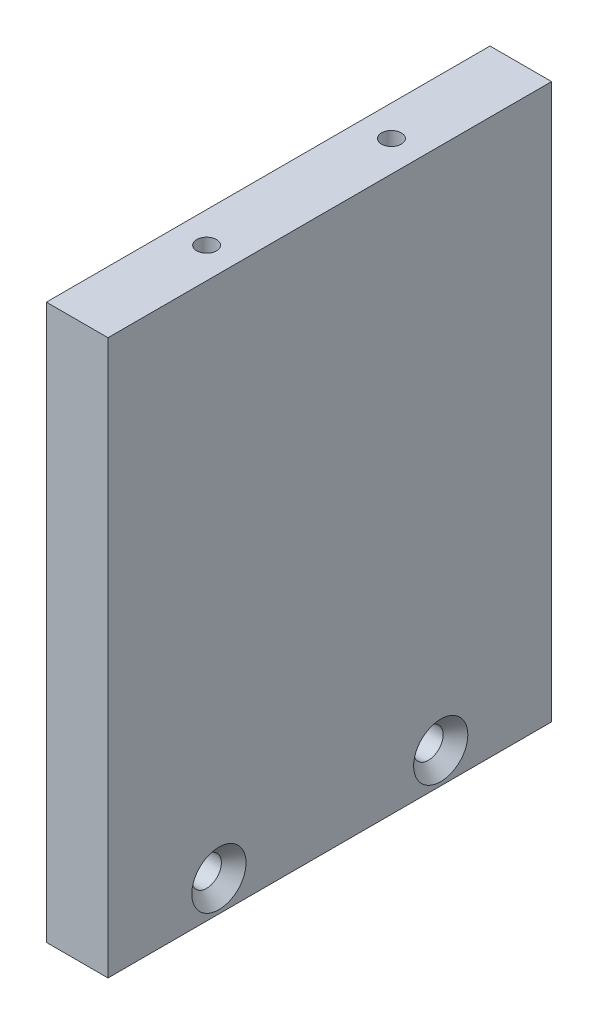
ISO-10303-21;
HEADER;
FILE_DESCRIPTION(('STEP AP214'),'2;1');
FILE_NAME('part.step','',(''),(''),'','','');
FILE_SCHEMA(('AUTOMOTIVE_DESIGN { 1 0 10303 214 1 1 1 1 }'));
ENDSEC;
DATA;
#1=APPLICATION_CONTEXT('core data for automotive mechanical design processes');
#2=APPLICATION_PROTOCOL_DEFINITION('international standard','automotive_design',2000,#1);
#3=PRODUCT_CONTEXT('',#1,'mechanical');
#4=PRODUCT('Part','Part','',(#3));
#5=PRODUCT_RELATED_PRODUCT_CATEGORY('part','',(#4));
#6=PRODUCT_DEFINITION_FORMATION('','',#4);
#7=PRODUCT_DEFINITION_CONTEXT('part definition',#1,'design');
#8=PRODUCT_DEFINITION('design','',#6,#7);
#9=PRODUCT_DEFINITION_SHAPE('','',#8);
#10=(LENGTH_UNIT() NAMED_UNIT(*) SI_UNIT(.MILLI.,.METRE.));
#11=(NAMED_UNIT(*) PLANE_ANGLE_UNIT() SI_UNIT($,.RADIAN.));
#12=(NAMED_UNIT(*) SI_UNIT($,.STERADIAN.) SOLID_ANGLE_UNIT());
#13=UNCERTAINTY_MEASURE_WITH_UNIT(LENGTH_MEASURE(1.E-05),#10,'distance_accuracy_value','');
#14=(GEOMETRIC_REPRESENTATION_CONTEXT(3) GLOBAL_UNCERTAINTY_ASSIGNED_CONTEXT((#13)) GLOBAL_UNIT_ASSIGNED_CONTEXT((#10,
#11,#12)) REPRESENTATION_CONTEXT('',''));
#15=CARTESIAN_POINT('',(0.,0.,0.));
#16=DIRECTION('',(0.,0.,1.));
#17=DIRECTION('',(1.,0.,0.));
#18=AXIS2_PLACEMENT_3D('',#15,#16,#17);
#19=CARTESIAN_POINT('',(5.,-22.5,18.));
#20=DIRECTION('',(0.,0.,-1.));
#21=DIRECTION('',(-1.,0.,0.));
#22=AXIS2_PLACEMENT_3D('',#19,#20,#21);
#23=PLANE('',#22);
#24=DIRECTION('',(0.,-1.,0.));
#25=VECTOR('',#24,1.);
#26=CARTESIAN_POINT('',(0.,-22.5,18.));
#27=LINE('',#26,#25);
#28=CARTESIAN_POINT('',(0.,22.5,18.));
#29=VERTEX_POINT('',#28);
#30=CARTESIAN_POINT('',(0.,-22.5,18.));
#31=VERTEX_POINT('',#30);
#32=EDGE_CURVE('E131',#29,#31,#27,.T.);
#33=ORIENTED_EDGE('',*,*,#32,.T.);
#34=DIRECTION('',(-1.,0.,0.));
#35=VECTOR('',#34,1.);
#36=CARTESIAN_POINT('',(5.,-22.5,18.));
#37=LINE('',#36,#35);
#38=CARTESIAN_POINT('',(5.,-22.5,18.));
#39=VERTEX_POINT('',#38);
#40=EDGE_CURVE('E13',#39,#31,#37,.T.);
#41=ORIENTED_EDGE('',*,*,#40,.F.);
#42=DIRECTION('',(0.,-1.,0.));
#43=VECTOR('',#42,1.);
#44=CARTESIAN_POINT('',(5.,-22.5,18.));
#45=LINE('',#44,#43);
#46=CARTESIAN_POINT('',(5.,22.5,18.));
#47=VERTEX_POINT('',#46);
#48=EDGE_CURVE('E132',#47,#39,#45,.T.);
#49=ORIENTED_EDGE('',*,*,#48,.F.);
#50=DIRECTION('',(-1.,0.,0.));
#51=VECTOR('',#50,1.);
#52=CARTESIAN_POINT('',(5.,22.5,18.));
#53=LINE('',#52,#51);
#54=EDGE_CURVE('E138',#47,#29,#53,.T.);
#55=ORIENTED_EDGE('',*,*,#54,.T.);
#56=EDGE_LOOP('',(#33,#41,#49,#55));
#57=FACE_BOUND('',#56,.T.);
#58=ADVANCED_FACE('F54',(#57),#23,.F.);
#59=CARTESIAN_POINT('',(5.,-22.5,-18.));
#60=DIRECTION('',(0.,1.,0.));
#61=DIRECTION('',(0.,0.,1.));
#62=AXIS2_PLACEMENT_3D('',#59,#60,#61);
#63=PLANE('',#62);
#64=DIRECTION('',(0.,0.,-1.));
#65=VECTOR('',#64,1.);
#66=CARTESIAN_POINT('',(0.,-22.5,-18.));
#67=LINE('',#66,#65);
#68=CARTESIAN_POINT('',(0.,-22.5,-18.));
#69=VERTEX_POINT('',#68);
#70=EDGE_CURVE('E141',#31,#69,#67,.T.);
#71=ORIENTED_EDGE('',*,*,#70,.T.);
#72=DIRECTION('',(-1.,0.,0.));
#73=VECTOR('',#72,1.);
#74=CARTESIAN_POINT('',(5.,-22.5,-18.));
#75=LINE('',#74,#73);
#76=CARTESIAN_POINT('',(5.,-22.5,-18.));
#77=VERTEX_POINT('',#76);
#78=EDGE_CURVE('E62',#77,#69,#75,.T.);
#79=ORIENTED_EDGE('',*,*,#78,.F.);
#80=DIRECTION('',(0.,0.,-1.));
#81=VECTOR('',#80,1.);
#82=CARTESIAN_POINT('',(5.,-22.5,-18.));
#83=LINE('',#82,#81);
#84=EDGE_CURVE('E101',#39,#77,#83,.T.);
#85=ORIENTED_EDGE('',*,*,#84,.F.);
#86=ORIENTED_EDGE('',*,*,#40,.T.);
#87=EDGE_LOOP('',(#71,#79,#85,#86));
#88=FACE_BOUND('',#87,.T.);
#89=ADVANCED_FACE('F166',(#88),#63,.F.);
#90=CARTESIAN_POINT('',(5.,-22.5,-18.));
#91=DIRECTION('',(0.,0.,1.));
#92=DIRECTION('',(1.,0.,0.));
#93=AXIS2_PLACEMENT_3D('',#90,#91,#92);
#94=PLANE('',#93);
#95=DIRECTION('',(0.,1.,0.));
#96=VECTOR('',#95,1.);
#97=CARTESIAN_POINT('',(0.,-22.5,-18.));
#98=LINE('',#97,#96);
#99=CARTESIAN_POINT('',(0.,22.5,-18.));
#100=VERTEX_POINT('',#99);
#101=EDGE_CURVE('E88',#69,#100,#98,.T.);
#102=ORIENTED_EDGE('',*,*,#101,.T.);
#103=DIRECTION('',(-1.,0.,0.));
#104=VECTOR('',#103,1.);
#105=CARTESIAN_POINT('',(5.,22.5,-18.));
#106=LINE('',#105,#104);
#107=CARTESIAN_POINT('',(5.,22.5,-18.));
#108=VERTEX_POINT('',#107);
#109=EDGE_CURVE('E146',#108,#100,#106,.T.);
#110=ORIENTED_EDGE('',*,*,#109,.F.);
#111=DIRECTION('',(0.,1.,0.));
#112=VECTOR('',#111,1.);
#113=CARTESIAN_POINT('',(5.,-22.5,-18.));
#114=LINE('',#113,#112);
#115=EDGE_CURVE('E135',#77,#108,#114,.T.);
#116=ORIENTED_EDGE('',*,*,#115,.F.);
#117=ORIENTED_EDGE('',*,*,#78,.T.);
#118=EDGE_LOOP('',(#102,#110,#116,#117));
#119=FACE_BOUND('',#118,.T.);
#120=ADVANCED_FACE('F148',(#119),#94,.F.);
#121=CARTESIAN_POINT('',(5.,22.5,-18.));
#122=DIRECTION('',(0.,-1.,0.));
#123=DIRECTION('',(0.,0.,-1.));
#124=AXIS2_PLACEMENT_3D('',#121,#122,#123);
#125=PLANE('',#124);
#126=CARTESIAN_POINT('',(2.5,22.5,-7.5));
#127=DIRECTION('',(0.,1.,0.));
#128=DIRECTION('',(0.,0.,1.));
#129=AXIS2_PLACEMENT_3D('',#126,#127,#128);
#130=CIRCLE('',#129,0.79999999999999);
#131=CARTESIAN_POINT('',(2.5,22.5,-6.70000000000001));
#132=VERTEX_POINT('',#131);
#133=EDGE_CURVE('E119',#132,#132,#130,.T.);
#134=ORIENTED_EDGE('',*,*,#133,.F.);
#135=EDGE_LOOP('',(#134));
#136=FACE_BOUND('',#135,.T.);
#137=CARTESIAN_POINT('',(2.5,22.5,7.5));
#138=DIRECTION('',(0.,1.,0.));
#139=DIRECTION('',(0.,0.,1.));
#140=AXIS2_PLACEMENT_3D('',#137,#138,#139);
#141=CIRCLE('',#140,0.79999999999999);
#142=CARTESIAN_POINT('',(2.5,22.5,8.3));
#143=VERTEX_POINT('',#142);
#144=EDGE_CURVE('E118',#143,#143,#141,.T.);
#145=ORIENTED_EDGE('',*,*,#144,.F.);
#146=EDGE_LOOP('',(#145));
#147=FACE_BOUND('',#146,.T.);
#148=DIRECTION('',(0.,0.,1.));
#149=VECTOR('',#148,1.);
#150=CARTESIAN_POINT('',(0.,22.5,-18.));
#151=LINE('',#150,#149);
#152=EDGE_CURVE('E94',#100,#29,#151,.T.);
#153=ORIENTED_EDGE('',*,*,#152,.T.);
#154=ORIENTED_EDGE('',*,*,#54,.F.);
#155=DIRECTION('',(0.,0.,1.));
#156=VECTOR('',#155,1.);
#157=CARTESIAN_POINT('',(5.,22.5,-18.));
#158=LINE('',#157,#156);
#159=EDGE_CURVE('E70',#108,#47,#158,.T.);
#160=ORIENTED_EDGE('',*,*,#159,.F.);
#161=ORIENTED_EDGE('',*,*,#109,.T.);
#162=EDGE_LOOP('',(#153,#154,#160,#161));
#163=FACE_BOUND('',#162,.T.);
#164=ADVANCED_FACE('F155',(#136,#147,#163),#125,.F.);
#165=CARTESIAN_POINT('',(5.,0.,0.));
#166=DIRECTION('',(1.,0.,0.));
#167=DIRECTION('',(0.,0.,-1.));
#168=AXIS2_PLACEMENT_3D('',#165,#166,#167);
#169=PLANE('',#168);
#170=CARTESIAN_POINT('',(5.,-20.,9.));
#171=DIRECTION('',(1.,0.,0.));
#172=DIRECTION('',(0.,0.,-1.));
#173=AXIS2_PLACEMENT_3D('',#170,#171,#172);
#174=CIRCLE('',#173,2.2);
#175=CARTESIAN_POINT('',(5.,-20.,6.8));
#176=VERTEX_POINT('',#175);
#177=EDGE_CURVE('E290',#176,#176,#174,.T.);
#178=ORIENTED_EDGE('',*,*,#177,.F.);
#179=EDGE_LOOP('',(#178));
#180=FACE_BOUND('',#179,.T.);
#181=CARTESIAN_POINT('',(5.,-20.,-9.));
#182=DIRECTION('',(1.,0.,0.));
#183=DIRECTION('',(0.,0.,-1.));
#184=AXIS2_PLACEMENT_3D('',#181,#182,#183);
#185=CIRCLE('',#184,2.2);
#186=CARTESIAN_POINT('',(5.,-20.,-11.2));
#187=VERTEX_POINT('',#186);
#188=EDGE_CURVE('E297',#187,#187,#185,.T.);
#189=ORIENTED_EDGE('',*,*,#188,.F.);
#190=EDGE_LOOP('',(#189));
#191=FACE_BOUND('',#190,.T.);
#192=ORIENTED_EDGE('',*,*,#48,.T.);
#193=ORIENTED_EDGE('',*,*,#84,.T.);
#194=ORIENTED_EDGE('',*,*,#115,.T.);
#195=ORIENTED_EDGE('',*,*,#159,.T.);
#196=EDGE_LOOP('',(#192,#193,#194,#195));
#197=FACE_BOUND('',#196,.T.);
#198=ADVANCED_FACE('F157',(#180,#191,#197),#169,.T.);
#199=CARTESIAN_POINT('',(0.,0.,0.));
#200=DIRECTION('',(1.,0.,0.));
#201=DIRECTION('',(0.,0.,-1.));
#202=AXIS2_PLACEMENT_3D('',#199,#200,#201);
#203=PLANE('',#202);
#204=CARTESIAN_POINT('',(0.,-20.,9.));
#205=DIRECTION('',(1.,0.,0.));
#206=DIRECTION('',(0.,0.,-1.));
#207=AXIS2_PLACEMENT_3D('',#204,#205,#206);
#208=CIRCLE('',#207,1.19999999999999);
#209=CARTESIAN_POINT('',(0.,-20.,7.80000000000002));
#210=VERTEX_POINT('',#209);
#211=EDGE_CURVE('E292',#210,#210,#208,.T.);
#212=ORIENTED_EDGE('',*,*,#211,.T.);
#213=EDGE_LOOP('',(#212));
#214=FACE_BOUND('',#213,.T.);
#215=CARTESIAN_POINT('',(0.,-20.,-9.));
#216=DIRECTION('',(1.,0.,0.));
#217=DIRECTION('',(0.,0.,-1.));
#218=AXIS2_PLACEMENT_3D('',#215,#216,#217);
#219=CIRCLE('',#218,1.19999999999999);
#220=CARTESIAN_POINT('',(0.,-20.,-10.2));
#221=VERTEX_POINT('',#220);
#222=EDGE_CURVE('E125',#221,#221,#219,.T.);
#223=ORIENTED_EDGE('',*,*,#222,.T.);
#224=EDGE_LOOP('',(#223));
#225=FACE_BOUND('',#224,.T.);
#226=ORIENTED_EDGE('',*,*,#32,.F.);
#227=ORIENTED_EDGE('',*,*,#152,.F.);
#228=ORIENTED_EDGE('',*,*,#101,.F.);
#229=ORIENTED_EDGE('',*,*,#70,.F.);
#230=EDGE_LOOP('',(#226,#227,#228,#229));
#231=FACE_BOUND('',#230,.T.);
#232=ADVANCED_FACE('F151',(#214,#225,#231),#203,.F.);
#233=CARTESIAN_POINT('',(2.5,17.5,7.5));
#234=DIRECTION('',(0.,1.,0.));
#235=DIRECTION('',(0.,0.,1.));
#236=AXIS2_PLACEMENT_3D('',#233,#234,#235);
#237=CONICAL_SURFACE('',#236,0.799999999999988,1.02974425867665);
#238=CARTESIAN_POINT('',(2.5,17.019311504778,7.5));
#239=VERTEX_POINT('',#238);
#240=VERTEX_LOOP('',#239);
#241=FACE_BOUND('',#240,.T.);
#242=CARTESIAN_POINT('',(2.5,17.5,7.5));
#243=DIRECTION('',(0.,1.,0.));
#244=DIRECTION('',(0.,0.,1.));
#245=AXIS2_PLACEMENT_3D('',#242,#243,#244);
#246=CIRCLE('',#245,0.799999999999988);
#247=CARTESIAN_POINT('',(2.5,17.5,8.29999999999999));
#248=VERTEX_POINT('',#247);
#249=EDGE_CURVE('E122',#248,#248,#246,.T.);
#250=ORIENTED_EDGE('',*,*,#249,.T.);
#251=EDGE_LOOP('',(#250));
#252=FACE_BOUND('',#251,.T.);
#253=ADVANCED_FACE('F196',(#241,#252),#237,.F.);
#254=CARTESIAN_POINT('',(2.5,22.5,7.5));
#255=DIRECTION('',(0.,1.,0.));
#256=DIRECTION('',(0.,0.,1.));
#257=AXIS2_PLACEMENT_3D('',#254,#255,#256);
#258=CYLINDRICAL_SURFACE('',#257,0.799999999999989);
#259=ORIENTED_EDGE('',*,*,#249,.F.);
#260=EDGE_LOOP('',(#259));
#261=FACE_BOUND('',#260,.T.);
#262=ORIENTED_EDGE('',*,*,#144,.T.);
#263=EDGE_LOOP('',(#262));
#264=FACE_BOUND('',#263,.T.);
#265=ADVANCED_FACE('F112',(#261,#264),#258,.F.);
#266=CARTESIAN_POINT('',(2.5,17.5,-7.5));
#267=DIRECTION('',(0.,1.,0.));
#268=DIRECTION('',(0.,0.,1.));
#269=AXIS2_PLACEMENT_3D('',#266,#267,#268);
#270=CONICAL_SURFACE('',#269,0.799999999999988,1.02974425867665);
#271=CARTESIAN_POINT('',(2.5,17.019311504778,-7.5));
#272=VERTEX_POINT('',#271);
#273=VERTEX_LOOP('',#272);
#274=FACE_BOUND('',#273,.T.);
#275=CARTESIAN_POINT('',(2.5,17.5,-7.5));
#276=DIRECTION('',(0.,1.,0.));
#277=DIRECTION('',(0.,0.,1.));
#278=AXIS2_PLACEMENT_3D('',#275,#276,#277);
#279=CIRCLE('',#278,0.799999999999988);
#280=CARTESIAN_POINT('',(2.5,17.5,-6.70000000000001));
#281=VERTEX_POINT('',#280);
#282=EDGE_CURVE('E116',#281,#281,#279,.T.);
#283=ORIENTED_EDGE('',*,*,#282,.T.);
#284=EDGE_LOOP('',(#283));
#285=FACE_BOUND('',#284,.T.);
#286=ADVANCED_FACE('F108',(#274,#285),#270,.F.);
#287=CARTESIAN_POINT('',(2.5,22.5,-7.5));
#288=DIRECTION('',(0.,1.,0.));
#289=DIRECTION('',(0.,0.,1.));
#290=AXIS2_PLACEMENT_3D('',#287,#288,#289);
#291=CYLINDRICAL_SURFACE('',#290,0.799999999999989);
#292=ORIENTED_EDGE('',*,*,#282,.F.);
#293=EDGE_LOOP('',(#292));
#294=FACE_BOUND('',#293,.T.);
#295=ORIENTED_EDGE('',*,*,#133,.T.);
#296=EDGE_LOOP('',(#295));
#297=FACE_BOUND('',#296,.T.);
#298=ADVANCED_FACE('F111',(#294,#297),#291,.F.);
#299=CARTESIAN_POINT('',(5.,-20.,-9.));
#300=DIRECTION('',(1.,0.,0.));
#301=DIRECTION('',(0.,0.,-1.));
#302=AXIS2_PLACEMENT_3D('',#299,#300,#301);
#303=CYLINDRICAL_SURFACE('',#302,1.19999999999999);
#304=ORIENTED_EDGE('',*,*,#222,.F.);
#305=EDGE_LOOP('',(#304));
#306=FACE_BOUND('',#305,.T.);
#307=CARTESIAN_POINT('',(4.,-20.,-9.));
#308=DIRECTION('',(1.,0.,0.));
#309=DIRECTION('',(0.,0.,-1.));
#310=AXIS2_PLACEMENT_3D('',#307,#308,#309);
#311=CIRCLE('',#310,1.2);
#312=CARTESIAN_POINT('',(4.,-20.,-10.2));
#313=VERTEX_POINT('',#312);
#314=EDGE_CURVE('E300',#313,#313,#311,.T.);
#315=ORIENTED_EDGE('',*,*,#314,.T.);
#316=EDGE_LOOP('',(#315));
#317=FACE_BOUND('',#316,.T.);
#318=ADVANCED_FACE('F229',(#306,#317),#303,.F.);
#319=CARTESIAN_POINT('',(5.,-20.,-9.));
#320=DIRECTION('',(1.,0.,0.));
#321=DIRECTION('',(0.,0.,-1.));
#322=AXIS2_PLACEMENT_3D('',#319,#320,#321);
#323=CONICAL_SURFACE('',#322,2.2,0.785398163397448);
#324=ORIENTED_EDGE('',*,*,#314,.F.);
#325=EDGE_LOOP('',(#324));
#326=FACE_BOUND('',#325,.T.);
#327=ORIENTED_EDGE('',*,*,#188,.T.);
#328=EDGE_LOOP('',(#327));
#329=FACE_BOUND('',#328,.T.);
#330=ADVANCED_FACE('F250',(#326,#329),#323,.F.);
#331=CARTESIAN_POINT('',(5.,-20.,9.));
#332=DIRECTION('',(1.,0.,0.));
#333=DIRECTION('',(0.,0.,-1.));
#334=AXIS2_PLACEMENT_3D('',#331,#332,#333);
#335=CYLINDRICAL_SURFACE('',#334,1.19999999999999);
#336=ORIENTED_EDGE('',*,*,#211,.F.);
#337=EDGE_LOOP('',(#336));
#338=FACE_BOUND('',#337,.T.);
#339=CARTESIAN_POINT('',(4.,-20.,9.));
#340=DIRECTION('',(1.,0.,0.));
#341=DIRECTION('',(0.,0.,-1.));
#342=AXIS2_PLACEMENT_3D('',#339,#340,#341);
#343=CIRCLE('',#342,1.2);
#344=CARTESIAN_POINT('',(4.,-20.,7.8));
#345=VERTEX_POINT('',#344);
#346=EDGE_CURVE('E287',#345,#345,#343,.T.);
#347=ORIENTED_EDGE('',*,*,#346,.T.);
#348=EDGE_LOOP('',(#347));
#349=FACE_BOUND('',#348,.T.);
#350=ADVANCED_FACE('F260',(#338,#349),#335,.F.);
#351=CARTESIAN_POINT('',(5.,-20.,9.));
#352=DIRECTION('',(1.,0.,0.));
#353=DIRECTION('',(0.,0.,-1.));
#354=AXIS2_PLACEMENT_3D('',#351,#352,#353);
#355=CONICAL_SURFACE('',#354,2.2,0.785398163397448);
#356=ORIENTED_EDGE('',*,*,#346,.F.);
#357=EDGE_LOOP('',(#356));
#358=FACE_BOUND('',#357,.T.);
#359=ORIENTED_EDGE('',*,*,#177,.T.);
#360=EDGE_LOOP('',(#359));
#361=FACE_BOUND('',#360,.T.);
#362=ADVANCED_FACE('F270',(#358,#361),#355,.F.);
#363=CLOSED_SHELL('',(#58,#89,#120,#164,#198,#232,#253,#265,#286,#298,#318,#330,#350,#362));
#364=MANIFOLD_SOLID_BREP('B2',#363);
#365=ADVANCED_BREP_SHAPE_REPRESENTATION('',(#18,#364),#14);
#366=SHAPE_DEFINITION_REPRESENTATION(#9,#365);
ENDSEC;
END-ISO-10303-21;
